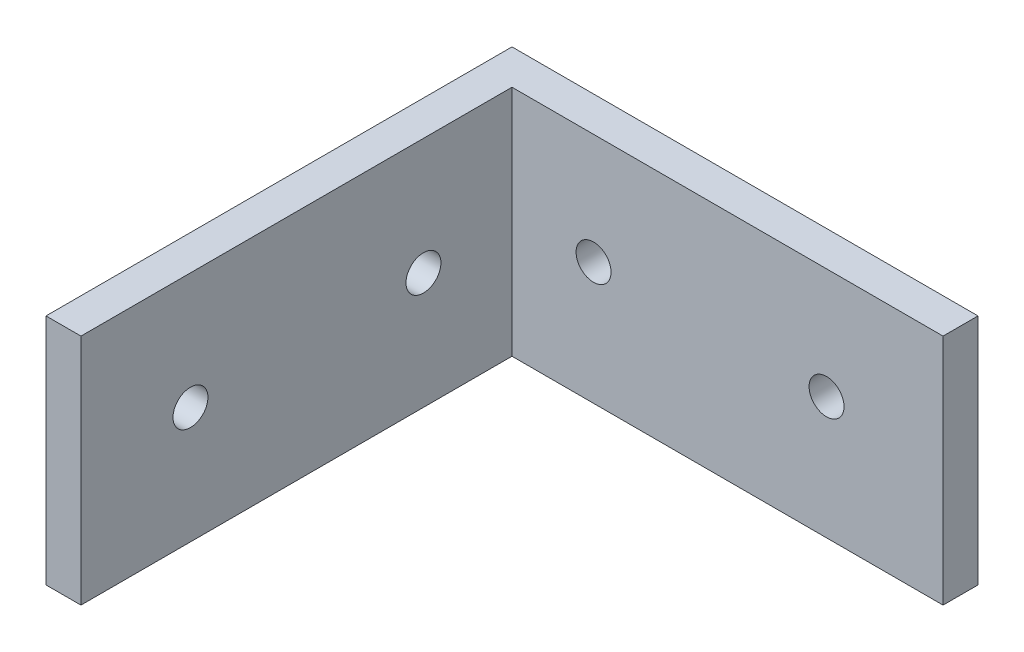
ISO-10303-21;
HEADER;
FILE_DESCRIPTION(('STEP AP214'),'2;1');
FILE_NAME('part.step','',(''),(''),'','','');
FILE_SCHEMA(('AUTOMOTIVE_DESIGN { 1 0 10303 214 1 1 1 1 }'));
ENDSEC;
DATA;
#1=APPLICATION_CONTEXT('core data for automotive mechanical design processes');
#2=APPLICATION_PROTOCOL_DEFINITION('international standard','automotive_design',2000,#1);
#3=PRODUCT_CONTEXT('',#1,'mechanical');
#4=PRODUCT('Part','Part','',(#3));
#5=PRODUCT_RELATED_PRODUCT_CATEGORY('part','',(#4));
#6=PRODUCT_DEFINITION_FORMATION('','',#4);
#7=PRODUCT_DEFINITION_CONTEXT('part definition',#1,'design');
#8=PRODUCT_DEFINITION('design','',#6,#7);
#9=PRODUCT_DEFINITION_SHAPE('','',#8);
#10=(LENGTH_UNIT() NAMED_UNIT(*) SI_UNIT(.MILLI.,.METRE.));
#11=(NAMED_UNIT(*) PLANE_ANGLE_UNIT() SI_UNIT($,.RADIAN.));
#12=(NAMED_UNIT(*) SI_UNIT($,.STERADIAN.) SOLID_ANGLE_UNIT());
#13=UNCERTAINTY_MEASURE_WITH_UNIT(LENGTH_MEASURE(1.E-05),#10,'distance_accuracy_value','');
#14=(GEOMETRIC_REPRESENTATION_CONTEXT(3) GLOBAL_UNCERTAINTY_ASSIGNED_CONTEXT((#13)) GLOBAL_UNIT_ASSIGNED_CONTEXT((#10,
#11,#12)) REPRESENTATION_CONTEXT('',''));
#15=CARTESIAN_POINT('',(0.,0.,0.));
#16=DIRECTION('',(0.,0.,1.));
#17=DIRECTION('',(1.,0.,0.));
#18=AXIS2_PLACEMENT_3D('',#15,#16,#17);
#19=CARTESIAN_POINT('',(0.,0.,3.));
#20=DIRECTION('',(0.,0.,-1.));
#21=DIRECTION('',(-1.,0.,0.));
#22=AXIS2_PLACEMENT_3D('',#19,#20,#21);
#23=PLANE('',#22);
#24=CARTESIAN_POINT('',(10.,10.5,3.));
#25=DIRECTION('',(0.,0.,1.));
#26=DIRECTION('',(1.,0.,0.));
#27=AXIS2_PLACEMENT_3D('',#24,#25,#26);
#28=CIRCLE('',#27,1.5);
#29=CARTESIAN_POINT('',(11.5,10.5,3.));
#30=VERTEX_POINT('',#29);
#31=EDGE_CURVE('E103',#30,#30,#28,.T.);
#32=ORIENTED_EDGE('',*,*,#31,.F.);
#33=EDGE_LOOP('',(#32));
#34=FACE_BOUND('',#33,.T.);
#35=CARTESIAN_POINT('',(30.,10.5,3.));
#36=DIRECTION('',(0.,0.,1.));
#37=DIRECTION('',(1.,0.,0.));
#38=AXIS2_PLACEMENT_3D('',#35,#36,#37);
#39=CIRCLE('',#38,1.5);
#40=CARTESIAN_POINT('',(31.5,10.5,3.));
#41=VERTEX_POINT('',#40);
#42=EDGE_CURVE('E148',#41,#41,#39,.T.);
#43=ORIENTED_EDGE('',*,*,#42,.F.);
#44=EDGE_LOOP('',(#43));
#45=FACE_BOUND('',#44,.T.);
#46=DIRECTION('',(0.,1.,0.));
#47=VECTOR('',#46,1.);
#48=CARTESIAN_POINT('',(3.,20.,3.));
#49=LINE('',#48,#47);
#50=CARTESIAN_POINT('',(3.,0.,3.));
#51=VERTEX_POINT('',#50);
#52=CARTESIAN_POINT('',(3.,20.,3.));
#53=VERTEX_POINT('',#52);
#54=EDGE_CURVE('E48',#51,#53,#49,.T.);
#55=ORIENTED_EDGE('',*,*,#54,.F.);
#56=DIRECTION('',(1.,0.,0.));
#57=VECTOR('',#56,1.);
#58=CARTESIAN_POINT('',(0.,0.,3.));
#59=LINE('',#58,#57);
#60=CARTESIAN_POINT('',(40.,0.,3.));
#61=VERTEX_POINT('',#60);
#62=EDGE_CURVE('E85',#51,#61,#59,.T.);
#63=ORIENTED_EDGE('',*,*,#62,.T.);
#64=DIRECTION('',(0.,1.,0.));
#65=VECTOR('',#64,1.);
#66=CARTESIAN_POINT('',(40.,0.,3.));
#67=LINE('',#66,#65);
#68=CARTESIAN_POINT('',(40.,20.,3.));
#69=VERTEX_POINT('',#68);
#70=EDGE_CURVE('E54',#61,#69,#67,.T.);
#71=ORIENTED_EDGE('',*,*,#70,.T.);
#72=DIRECTION('',(-1.,0.,0.));
#73=VECTOR('',#72,1.);
#74=CARTESIAN_POINT('',(0.,20.,3.));
#75=LINE('',#74,#73);
#76=EDGE_CURVE('E95',#69,#53,#75,.T.);
#77=ORIENTED_EDGE('',*,*,#76,.T.);
#78=EDGE_LOOP('',(#55,#63,#71,#77));
#79=FACE_BOUND('',#78,.T.);
#80=ADVANCED_FACE('F33',(#34,#45,#79),#23,.F.);
#81=CARTESIAN_POINT('',(0.,0.,3.));
#82=DIRECTION('',(1.,0.,0.));
#83=DIRECTION('',(0.,0.,-1.));
#84=AXIS2_PLACEMENT_3D('',#81,#82,#83);
#85=PLANE('',#84);
#86=CARTESIAN_POINT('',(0.,10.,30.6));
#87=DIRECTION('',(-1.,0.,0.));
#88=DIRECTION('',(0.,0.,1.));
#89=AXIS2_PLACEMENT_3D('',#86,#87,#88);
#90=CIRCLE('',#89,1.5);
#91=CARTESIAN_POINT('',(0.,10.,32.1));
#92=VERTEX_POINT('',#91);
#93=EDGE_CURVE('E279',#92,#92,#90,.T.);
#94=ORIENTED_EDGE('',*,*,#93,.F.);
#95=EDGE_LOOP('',(#94));
#96=FACE_BOUND('',#95,.T.);
#97=CARTESIAN_POINT('',(0.,10.,10.6));
#98=DIRECTION('',(-1.,0.,0.));
#99=DIRECTION('',(0.,0.,1.));
#100=AXIS2_PLACEMENT_3D('',#97,#98,#99);
#101=CIRCLE('',#100,1.5);
#102=CARTESIAN_POINT('',(0.,10.,12.1));
#103=VERTEX_POINT('',#102);
#104=EDGE_CURVE('E281',#103,#103,#101,.T.);
#105=ORIENTED_EDGE('',*,*,#104,.F.);
#106=EDGE_LOOP('',(#105));
#107=FACE_BOUND('',#106,.T.);
#108=DIRECTION('',(0.,-1.,0.));
#109=VECTOR('',#108,1.);
#110=CARTESIAN_POINT('',(0.,0.,0.));
#111=LINE('',#110,#109);
#112=CARTESIAN_POINT('',(0.,20.,0.));
#113=VERTEX_POINT('',#112);
#114=CARTESIAN_POINT('',(0.,0.,0.));
#115=VERTEX_POINT('',#114);
#116=EDGE_CURVE('E92',#113,#115,#111,.T.);
#117=ORIENTED_EDGE('',*,*,#116,.T.);
#118=DIRECTION('',(0.,0.,-1.));
#119=VECTOR('',#118,1.);
#120=CARTESIAN_POINT('',(0.,0.,3.));
#121=LINE('',#120,#119);
#122=CARTESIAN_POINT('',(0.,0.,40.));
#123=VERTEX_POINT('',#122);
#124=EDGE_CURVE('E11',#123,#115,#121,.T.);
#125=ORIENTED_EDGE('',*,*,#124,.F.);
#126=DIRECTION('',(0.,-1.,0.));
#127=VECTOR('',#126,1.);
#128=CARTESIAN_POINT('',(0.,20.,40.));
#129=LINE('',#128,#127);
#130=CARTESIAN_POINT('',(0.,20.,40.));
#131=VERTEX_POINT('',#130);
#132=EDGE_CURVE('E94',#131,#123,#129,.T.);
#133=ORIENTED_EDGE('',*,*,#132,.F.);
#134=DIRECTION('',(0.,0.,-1.));
#135=VECTOR('',#134,1.);
#136=CARTESIAN_POINT('',(0.,20.,3.));
#137=LINE('',#136,#135);
#138=EDGE_CURVE('E78',#131,#113,#137,.T.);
#139=ORIENTED_EDGE('',*,*,#138,.T.);
#140=EDGE_LOOP('',(#117,#125,#133,#139));
#141=FACE_BOUND('',#140,.T.);
#142=ADVANCED_FACE('F35',(#96,#107,#141),#85,.F.);
#143=CARTESIAN_POINT('',(0.,0.,3.));
#144=DIRECTION('',(0.,1.,0.));
#145=DIRECTION('',(0.,0.,1.));
#146=AXIS2_PLACEMENT_3D('',#143,#144,#145);
#147=PLANE('',#146);
#148=DIRECTION('',(1.,0.,0.));
#149=VECTOR('',#148,1.);
#150=CARTESIAN_POINT('',(0.,0.,0.));
#151=LINE('',#150,#149);
#152=CARTESIAN_POINT('',(40.,0.,0.));
#153=VERTEX_POINT('',#152);
#154=EDGE_CURVE('E98',#115,#153,#151,.T.);
#155=ORIENTED_EDGE('',*,*,#154,.T.);
#156=DIRECTION('',(0.,0.,-1.));
#157=VECTOR('',#156,1.);
#158=CARTESIAN_POINT('',(40.,0.,3.));
#159=LINE('',#158,#157);
#160=EDGE_CURVE('E41',#61,#153,#159,.T.);
#161=ORIENTED_EDGE('',*,*,#160,.F.);
#162=ORIENTED_EDGE('',*,*,#62,.F.);
#163=DIRECTION('',(0.,0.,-1.));
#164=VECTOR('',#163,1.);
#165=CARTESIAN_POINT('',(3.,0.,40.));
#166=LINE('',#165,#164);
#167=CARTESIAN_POINT('',(3.,0.,40.));
#168=VERTEX_POINT('',#167);
#169=EDGE_CURVE('E140',#168,#51,#166,.T.);
#170=ORIENTED_EDGE('',*,*,#169,.F.);
#171=DIRECTION('',(1.,0.,0.));
#172=VECTOR('',#171,1.);
#173=CARTESIAN_POINT('',(0.,0.,40.));
#174=LINE('',#173,#172);
#175=EDGE_CURVE('E120',#123,#168,#174,.T.);
#176=ORIENTED_EDGE('',*,*,#175,.F.);
#177=ORIENTED_EDGE('',*,*,#124,.T.);
#178=EDGE_LOOP('',(#155,#161,#162,#170,#176,#177));
#179=FACE_BOUND('',#178,.T.);
#180=ADVANCED_FACE('F114',(#179),#147,.F.);
#181=CARTESIAN_POINT('',(40.,0.,3.));
#182=DIRECTION('',(-1.,0.,0.));
#183=DIRECTION('',(0.,0.,1.));
#184=AXIS2_PLACEMENT_3D('',#181,#182,#183);
#185=PLANE('',#184);
#186=DIRECTION('',(0.,1.,0.));
#187=VECTOR('',#186,1.);
#188=CARTESIAN_POINT('',(40.,0.,0.));
#189=LINE('',#188,#187);
#190=CARTESIAN_POINT('',(40.,20.,0.));
#191=VERTEX_POINT('',#190);
#192=EDGE_CURVE('E86',#153,#191,#189,.T.);
#193=ORIENTED_EDGE('',*,*,#192,.T.);
#194=DIRECTION('',(0.,0.,-1.));
#195=VECTOR('',#194,1.);
#196=CARTESIAN_POINT('',(40.,20.,3.));
#197=LINE('',#196,#195);
#198=EDGE_CURVE('E81',#69,#191,#197,.T.);
#199=ORIENTED_EDGE('',*,*,#198,.F.);
#200=ORIENTED_EDGE('',*,*,#70,.F.);
#201=ORIENTED_EDGE('',*,*,#160,.T.);
#202=EDGE_LOOP('',(#193,#199,#200,#201));
#203=FACE_BOUND('',#202,.T.);
#204=ADVANCED_FACE('F112',(#203),#185,.F.);
#205=CARTESIAN_POINT('',(0.,20.,3.));
#206=DIRECTION('',(0.,-1.,0.));
#207=DIRECTION('',(0.,0.,-1.));
#208=AXIS2_PLACEMENT_3D('',#205,#206,#207);
#209=PLANE('',#208);
#210=DIRECTION('',(-1.,0.,0.));
#211=VECTOR('',#210,1.);
#212=CARTESIAN_POINT('',(0.,20.,0.));
#213=LINE('',#212,#211);
#214=EDGE_CURVE('E74',#191,#113,#213,.T.);
#215=ORIENTED_EDGE('',*,*,#214,.T.);
#216=ORIENTED_EDGE('',*,*,#138,.F.);
#217=DIRECTION('',(-1.,0.,0.));
#218=VECTOR('',#217,1.);
#219=CARTESIAN_POINT('',(0.,20.,40.));
#220=LINE('',#219,#218);
#221=CARTESIAN_POINT('',(3.,20.,40.));
#222=VERTEX_POINT('',#221);
#223=EDGE_CURVE('E134',#222,#131,#220,.T.);
#224=ORIENTED_EDGE('',*,*,#223,.F.);
#225=DIRECTION('',(0.,0.,-1.));
#226=VECTOR('',#225,1.);
#227=CARTESIAN_POINT('',(3.,20.,40.));
#228=LINE('',#227,#226);
#229=EDGE_CURVE('E138',#222,#53,#228,.T.);
#230=ORIENTED_EDGE('',*,*,#229,.T.);
#231=ORIENTED_EDGE('',*,*,#76,.F.);
#232=ORIENTED_EDGE('',*,*,#198,.T.);
#233=EDGE_LOOP('',(#215,#216,#224,#230,#231,#232));
#234=FACE_BOUND('',#233,.T.);
#235=ADVANCED_FACE('F76',(#234),#209,.F.);
#236=CARTESIAN_POINT('',(0.,0.,0.));
#237=DIRECTION('',(0.,0.,-1.));
#238=DIRECTION('',(-1.,0.,0.));
#239=AXIS2_PLACEMENT_3D('',#236,#237,#238);
#240=PLANE('',#239);
#241=CARTESIAN_POINT('',(30.,10.5,0.));
#242=DIRECTION('',(0.,0.,1.));
#243=DIRECTION('',(1.,0.,0.));
#244=AXIS2_PLACEMENT_3D('',#241,#242,#243);
#245=CIRCLE('',#244,1.5);
#246=CARTESIAN_POINT('',(31.5,10.5,0.));
#247=VERTEX_POINT('',#246);
#248=EDGE_CURVE('E149',#247,#247,#245,.T.);
#249=ORIENTED_EDGE('',*,*,#248,.T.);
#250=EDGE_LOOP('',(#249));
#251=FACE_BOUND('',#250,.T.);
#252=CARTESIAN_POINT('',(10.,10.5,0.));
#253=DIRECTION('',(0.,0.,1.));
#254=DIRECTION('',(1.,0.,0.));
#255=AXIS2_PLACEMENT_3D('',#252,#253,#254);
#256=CIRCLE('',#255,1.5);
#257=CARTESIAN_POINT('',(11.5,10.5,0.));
#258=VERTEX_POINT('',#257);
#259=EDGE_CURVE('E99',#258,#258,#256,.T.);
#260=ORIENTED_EDGE('',*,*,#259,.T.);
#261=EDGE_LOOP('',(#260));
#262=FACE_BOUND('',#261,.T.);
#263=ORIENTED_EDGE('',*,*,#116,.F.);
#264=ORIENTED_EDGE('',*,*,#214,.F.);
#265=ORIENTED_EDGE('',*,*,#192,.F.);
#266=ORIENTED_EDGE('',*,*,#154,.F.);
#267=EDGE_LOOP('',(#263,#264,#265,#266));
#268=FACE_BOUND('',#267,.T.);
#269=ADVANCED_FACE('F97',(#251,#262,#268),#240,.T.);
#270=CARTESIAN_POINT('',(10.,10.5,0.));
#271=DIRECTION('',(0.,0.,1.));
#272=DIRECTION('',(1.,0.,0.));
#273=AXIS2_PLACEMENT_3D('',#270,#271,#272);
#274=CYLINDRICAL_SURFACE('',#273,1.5);
#275=ORIENTED_EDGE('',*,*,#259,.F.);
#276=EDGE_LOOP('',(#275));
#277=FACE_BOUND('',#276,.T.);
#278=ORIENTED_EDGE('',*,*,#31,.T.);
#279=EDGE_LOOP('',(#278));
#280=FACE_BOUND('',#279,.T.);
#281=ADVANCED_FACE('F167',(#277,#280),#274,.F.);
#282=CARTESIAN_POINT('',(30.,10.5,0.));
#283=DIRECTION('',(0.,0.,1.));
#284=DIRECTION('',(1.,0.,0.));
#285=AXIS2_PLACEMENT_3D('',#282,#283,#284);
#286=CYLINDRICAL_SURFACE('',#285,1.5);
#287=ORIENTED_EDGE('',*,*,#248,.F.);
#288=EDGE_LOOP('',(#287));
#289=FACE_BOUND('',#288,.T.);
#290=ORIENTED_EDGE('',*,*,#42,.T.);
#291=EDGE_LOOP('',(#290));
#292=FACE_BOUND('',#291,.T.);
#293=ADVANCED_FACE('F199',(#289,#292),#286,.F.);
#294=CARTESIAN_POINT('',(3.,20.,40.));
#295=DIRECTION('',(-1.,0.,0.));
#296=DIRECTION('',(0.,-1.,0.));
#297=AXIS2_PLACEMENT_3D('',#294,#295,#296);
#298=PLANE('',#297);
#299=CARTESIAN_POINT('',(3.,10.,30.6));
#300=DIRECTION('',(-1.,0.,0.));
#301=DIRECTION('',(0.,0.,1.));
#302=AXIS2_PLACEMENT_3D('',#299,#300,#301);
#303=CIRCLE('',#302,1.5);
#304=CARTESIAN_POINT('',(3.,10.,32.1));
#305=VERTEX_POINT('',#304);
#306=EDGE_CURVE('E276',#305,#305,#303,.T.);
#307=ORIENTED_EDGE('',*,*,#306,.T.);
#308=EDGE_LOOP('',(#307));
#309=FACE_BOUND('',#308,.T.);
#310=CARTESIAN_POINT('',(3.,10.,10.6));
#311=DIRECTION('',(-1.,0.,0.));
#312=DIRECTION('',(0.,0.,1.));
#313=AXIS2_PLACEMENT_3D('',#310,#311,#312);
#314=CIRCLE('',#313,1.5);
#315=CARTESIAN_POINT('',(3.,10.,12.1));
#316=VERTEX_POINT('',#315);
#317=EDGE_CURVE('E145',#316,#316,#314,.T.);
#318=ORIENTED_EDGE('',*,*,#317,.T.);
#319=EDGE_LOOP('',(#318));
#320=FACE_BOUND('',#319,.T.);
#321=ORIENTED_EDGE('',*,*,#54,.T.);
#322=ORIENTED_EDGE('',*,*,#229,.F.);
#323=DIRECTION('',(0.,1.,0.));
#324=VECTOR('',#323,1.);
#325=CARTESIAN_POINT('',(3.,20.,40.));
#326=LINE('',#325,#324);
#327=EDGE_CURVE('E131',#168,#222,#326,.T.);
#328=ORIENTED_EDGE('',*,*,#327,.F.);
#329=ORIENTED_EDGE('',*,*,#169,.T.);
#330=EDGE_LOOP('',(#321,#322,#328,#329));
#331=FACE_BOUND('',#330,.T.);
#332=ADVANCED_FACE('F139',(#309,#320,#331),#298,.F.);
#333=CARTESIAN_POINT('',(0.,0.,40.));
#334=DIRECTION('',(0.,0.,1.));
#335=DIRECTION('',(1.,0.,0.));
#336=AXIS2_PLACEMENT_3D('',#333,#334,#335);
#337=PLANE('',#336);
#338=ORIENTED_EDGE('',*,*,#132,.T.);
#339=ORIENTED_EDGE('',*,*,#175,.T.);
#340=ORIENTED_EDGE('',*,*,#327,.T.);
#341=ORIENTED_EDGE('',*,*,#223,.T.);
#342=EDGE_LOOP('',(#338,#339,#340,#341));
#343=FACE_BOUND('',#342,.T.);
#344=ADVANCED_FACE('F133',(#343),#337,.T.);
#345=CARTESIAN_POINT('',(3.,10.,10.6));
#346=DIRECTION('',(-1.,0.,0.));
#347=DIRECTION('',(0.,0.,1.));
#348=AXIS2_PLACEMENT_3D('',#345,#346,#347);
#349=CYLINDRICAL_SURFACE('',#348,1.5);
#350=ORIENTED_EDGE('',*,*,#317,.F.);
#351=EDGE_LOOP('',(#350));
#352=FACE_BOUND('',#351,.T.);
#353=ORIENTED_EDGE('',*,*,#104,.T.);
#354=EDGE_LOOP('',(#353));
#355=FACE_BOUND('',#354,.T.);
#356=ADVANCED_FACE('F219',(#352,#355),#349,.F.);
#357=CARTESIAN_POINT('',(3.,10.,30.6));
#358=DIRECTION('',(-1.,0.,0.));
#359=DIRECTION('',(0.,0.,1.));
#360=AXIS2_PLACEMENT_3D('',#357,#358,#359);
#361=CYLINDRICAL_SURFACE('',#360,1.5);
#362=ORIENTED_EDGE('',*,*,#306,.F.);
#363=EDGE_LOOP('',(#362));
#364=FACE_BOUND('',#363,.T.);
#365=ORIENTED_EDGE('',*,*,#93,.T.);
#366=EDGE_LOOP('',(#365));
#367=FACE_BOUND('',#366,.T.);
#368=ADVANCED_FACE('F225',(#364,#367),#361,.F.);
#369=CLOSED_SHELL('',(#80,#142,#180,#204,#235,#269,#281,#293,#332,#344,#356,#368));
#370=MANIFOLD_SOLID_BREP('B2',#369);
#371=ADVANCED_BREP_SHAPE_REPRESENTATION('',(#18,#370),#14);
#372=SHAPE_DEFINITION_REPRESENTATION(#9,#371);
ENDSEC;
END-ISO-10303-21;
